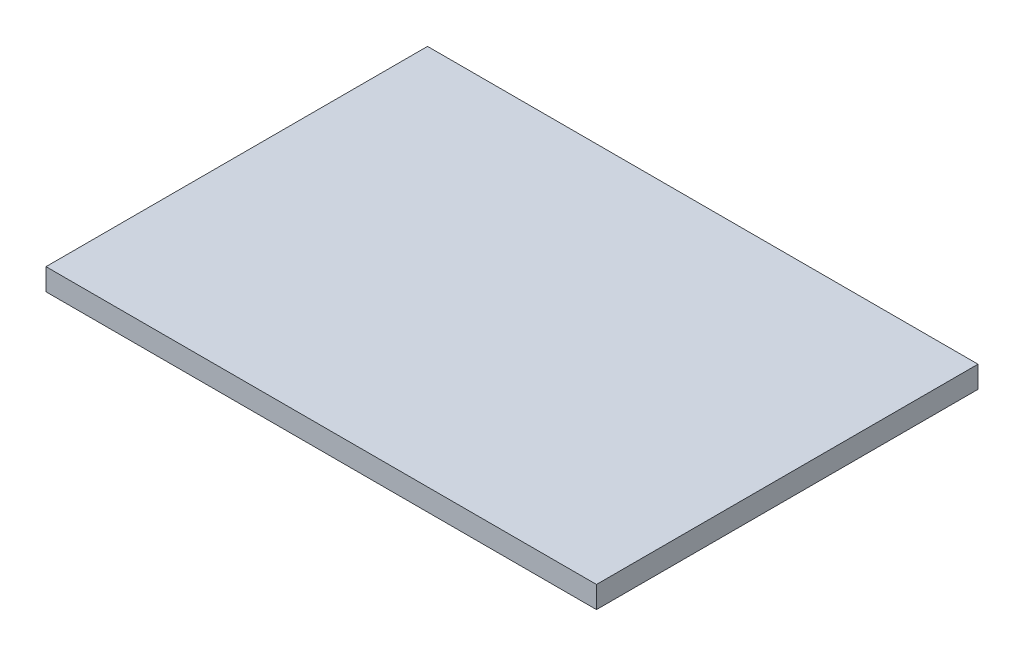
ISO-10303-21;
HEADER;
FILE_DESCRIPTION(('STEP AP214'),'2;1');
FILE_NAME('part.step','',(''),(''),'','','');
FILE_SCHEMA(('AUTOMOTIVE_DESIGN { 1 0 10303 214 1 1 1 1 }'));
ENDSEC;
DATA;
#1=APPLICATION_CONTEXT('core data for automotive mechanical design processes');
#2=APPLICATION_PROTOCOL_DEFINITION('international standard','automotive_design',2000,#1);
#3=PRODUCT_CONTEXT('',#1,'mechanical');
#4=PRODUCT('Part','Part','',(#3));
#5=PRODUCT_RELATED_PRODUCT_CATEGORY('part','',(#4));
#6=PRODUCT_DEFINITION_FORMATION('','',#4);
#7=PRODUCT_DEFINITION_CONTEXT('part definition',#1,'design');
#8=PRODUCT_DEFINITION('design','',#6,#7);
#9=PRODUCT_DEFINITION_SHAPE('','',#8);
#10=(LENGTH_UNIT() NAMED_UNIT(*) SI_UNIT(.MILLI.,.METRE.));
#11=(NAMED_UNIT(*) PLANE_ANGLE_UNIT() SI_UNIT($,.RADIAN.));
#12=(NAMED_UNIT(*) SI_UNIT($,.STERADIAN.) SOLID_ANGLE_UNIT());
#13=UNCERTAINTY_MEASURE_WITH_UNIT(LENGTH_MEASURE(1.E-05),#10,'distance_accuracy_value','');
#14=(GEOMETRIC_REPRESENTATION_CONTEXT(3) GLOBAL_UNCERTAINTY_ASSIGNED_CONTEXT((#13)) GLOBAL_UNIT_ASSIGNED_CONTEXT((#10,
#11,#12)) REPRESENTATION_CONTEXT('',''));
#15=CARTESIAN_POINT('',(0.,0.,0.));
#16=DIRECTION('',(0.,0.,1.));
#17=DIRECTION('',(1.,0.,0.));
#18=AXIS2_PLACEMENT_3D('',#15,#16,#17);
#19=CARTESIAN_POINT('',(505.,-20.,-350.));
#20=DIRECTION('',(0.,0.,1.));
#21=DIRECTION('',(1.,0.,0.));
#22=AXIS2_PLACEMENT_3D('',#19,#20,#21);
#23=PLANE('',#22);
#24=DIRECTION('',(0.,1.,0.));
#25=VECTOR('',#24,1.);
#26=CARTESIAN_POINT('',(-505.,-20.,-350.));
#27=LINE('',#26,#25);
#28=CARTESIAN_POINT('',(-505.,-20.,-350.));
#29=VERTEX_POINT('',#28);
#30=CARTESIAN_POINT('',(-505.,20.,-350.));
#31=VERTEX_POINT('',#30);
#32=EDGE_CURVE('E102',#29,#31,#27,.T.);
#33=ORIENTED_EDGE('',*,*,#32,.T.);
#34=DIRECTION('',(-1.,0.,0.));
#35=VECTOR('',#34,1.);
#36=CARTESIAN_POINT('',(505.,20.,-350.));
#37=LINE('',#36,#35);
#38=CARTESIAN_POINT('',(505.,20.,-350.));
#39=VERTEX_POINT('',#38);
#40=EDGE_CURVE('E11',#39,#31,#37,.T.);
#41=ORIENTED_EDGE('',*,*,#40,.F.);
#42=DIRECTION('',(0.,1.,0.));
#43=VECTOR('',#42,1.);
#44=CARTESIAN_POINT('',(505.,-20.,-350.));
#45=LINE('',#44,#43);
#46=CARTESIAN_POINT('',(505.,-20.,-350.));
#47=VERTEX_POINT('',#46);
#48=EDGE_CURVE('E90',#47,#39,#45,.T.);
#49=ORIENTED_EDGE('',*,*,#48,.F.);
#50=DIRECTION('',(-1.,0.,0.));
#51=VECTOR('',#50,1.);
#52=CARTESIAN_POINT('',(505.,-20.,-350.));
#53=LINE('',#52,#51);
#54=EDGE_CURVE('E98',#47,#29,#53,.T.);
#55=ORIENTED_EDGE('',*,*,#54,.T.);
#56=EDGE_LOOP('',(#33,#41,#49,#55));
#57=FACE_BOUND('',#56,.T.);
#58=ADVANCED_FACE('F39',(#57),#23,.F.);
#59=CARTESIAN_POINT('',(505.,20.,350.));
#60=DIRECTION('',(0.,-1.,0.));
#61=DIRECTION('',(0.,0.,-1.));
#62=AXIS2_PLACEMENT_3D('',#59,#60,#61);
#63=PLANE('',#62);
#64=DIRECTION('',(0.,0.,1.));
#65=VECTOR('',#64,1.);
#66=CARTESIAN_POINT('',(-505.,20.,350.));
#67=LINE('',#66,#65);
#68=CARTESIAN_POINT('',(-505.,20.,350.));
#69=VERTEX_POINT('',#68);
#70=EDGE_CURVE('E94',#31,#69,#67,.T.);
#71=ORIENTED_EDGE('',*,*,#70,.T.);
#72=DIRECTION('',(-1.,0.,0.));
#73=VECTOR('',#72,1.);
#74=CARTESIAN_POINT('',(505.,20.,350.));
#75=LINE('',#74,#73);
#76=CARTESIAN_POINT('',(505.,20.,350.));
#77=VERTEX_POINT('',#76);
#78=EDGE_CURVE('E47',#77,#69,#75,.T.);
#79=ORIENTED_EDGE('',*,*,#78,.F.);
#80=DIRECTION('',(0.,0.,1.));
#81=VECTOR('',#80,1.);
#82=CARTESIAN_POINT('',(505.,20.,350.));
#83=LINE('',#82,#81);
#84=EDGE_CURVE('E85',#39,#77,#83,.T.);
#85=ORIENTED_EDGE('',*,*,#84,.F.);
#86=ORIENTED_EDGE('',*,*,#40,.T.);
#87=EDGE_LOOP('',(#71,#79,#85,#86));
#88=FACE_BOUND('',#87,.T.);
#89=ADVANCED_FACE('F93',(#88),#63,.F.);
#90=CARTESIAN_POINT('',(505.,-20.,350.));
#91=DIRECTION('',(0.,0.,-1.));
#92=DIRECTION('',(-1.,0.,0.));
#93=AXIS2_PLACEMENT_3D('',#90,#91,#92);
#94=PLANE('',#93);
#95=DIRECTION('',(0.,-1.,0.));
#96=VECTOR('',#95,1.);
#97=CARTESIAN_POINT('',(-505.,-20.,350.));
#98=LINE('',#97,#96);
#99=CARTESIAN_POINT('',(-505.,-20.,350.));
#100=VERTEX_POINT('',#99);
#101=EDGE_CURVE('E72',#69,#100,#98,.T.);
#102=ORIENTED_EDGE('',*,*,#101,.T.);
#103=DIRECTION('',(-1.,0.,0.));
#104=VECTOR('',#103,1.);
#105=CARTESIAN_POINT('',(505.,-20.,350.));
#106=LINE('',#105,#104);
#107=CARTESIAN_POINT('',(505.,-20.,350.));
#108=VERTEX_POINT('',#107);
#109=EDGE_CURVE('E95',#108,#100,#106,.T.);
#110=ORIENTED_EDGE('',*,*,#109,.F.);
#111=DIRECTION('',(0.,-1.,0.));
#112=VECTOR('',#111,1.);
#113=CARTESIAN_POINT('',(505.,-20.,350.));
#114=LINE('',#113,#112);
#115=EDGE_CURVE('E88',#77,#108,#114,.T.);
#116=ORIENTED_EDGE('',*,*,#115,.F.);
#117=ORIENTED_EDGE('',*,*,#78,.T.);
#118=EDGE_LOOP('',(#102,#110,#116,#117));
#119=FACE_BOUND('',#118,.T.);
#120=ADVANCED_FACE('F96',(#119),#94,.F.);
#121=CARTESIAN_POINT('',(505.,-20.,350.));
#122=DIRECTION('',(0.,1.,0.));
#123=DIRECTION('',(0.,0.,1.));
#124=AXIS2_PLACEMENT_3D('',#121,#122,#123);
#125=PLANE('',#124);
#126=DIRECTION('',(0.,0.,-1.));
#127=VECTOR('',#126,1.);
#128=CARTESIAN_POINT('',(-505.,-20.,350.));
#129=LINE('',#128,#127);
#130=EDGE_CURVE('E78',#100,#29,#129,.T.);
#131=ORIENTED_EDGE('',*,*,#130,.T.);
#132=ORIENTED_EDGE('',*,*,#54,.F.);
#133=DIRECTION('',(0.,0.,-1.));
#134=VECTOR('',#133,1.);
#135=CARTESIAN_POINT('',(505.,-20.,350.));
#136=LINE('',#135,#134);
#137=EDGE_CURVE('E55',#108,#47,#136,.T.);
#138=ORIENTED_EDGE('',*,*,#137,.F.);
#139=ORIENTED_EDGE('',*,*,#109,.T.);
#140=EDGE_LOOP('',(#131,#132,#138,#139));
#141=FACE_BOUND('',#140,.T.);
#142=ADVANCED_FACE('F109',(#141),#125,.F.);
#143=CARTESIAN_POINT('',(505.,0.,0.));
#144=DIRECTION('',(-1.,0.,0.));
#145=DIRECTION('',(0.,0.,1.));
#146=AXIS2_PLACEMENT_3D('',#143,#144,#145);
#147=PLANE('',#146);
#148=ORIENTED_EDGE('',*,*,#48,.T.);
#149=ORIENTED_EDGE('',*,*,#84,.T.);
#150=ORIENTED_EDGE('',*,*,#115,.T.);
#151=ORIENTED_EDGE('',*,*,#137,.T.);
#152=EDGE_LOOP('',(#148,#149,#150,#151));
#153=FACE_BOUND('',#152,.T.);
#154=ADVANCED_FACE('F86',(#153),#147,.F.);
#155=CARTESIAN_POINT('',(-505.,0.,0.));
#156=DIRECTION('',(-1.,0.,0.));
#157=DIRECTION('',(0.,0.,1.));
#158=AXIS2_PLACEMENT_3D('',#155,#156,#157);
#159=PLANE('',#158);
#160=ORIENTED_EDGE('',*,*,#32,.F.);
#161=ORIENTED_EDGE('',*,*,#130,.F.);
#162=ORIENTED_EDGE('',*,*,#101,.F.);
#163=ORIENTED_EDGE('',*,*,#70,.F.);
#164=EDGE_LOOP('',(#160,#161,#162,#163));
#165=FACE_BOUND('',#164,.T.);
#166=ADVANCED_FACE('F112',(#165),#159,.T.);
#167=CLOSED_SHELL('',(#58,#89,#120,#142,#154,#166));
#168=MANIFOLD_SOLID_BREP('B2',#167);
#169=ADVANCED_BREP_SHAPE_REPRESENTATION('',(#18,#168),#14);
#170=SHAPE_DEFINITION_REPRESENTATION(#9,#169);
ENDSEC;
END-ISO-10303-21;
